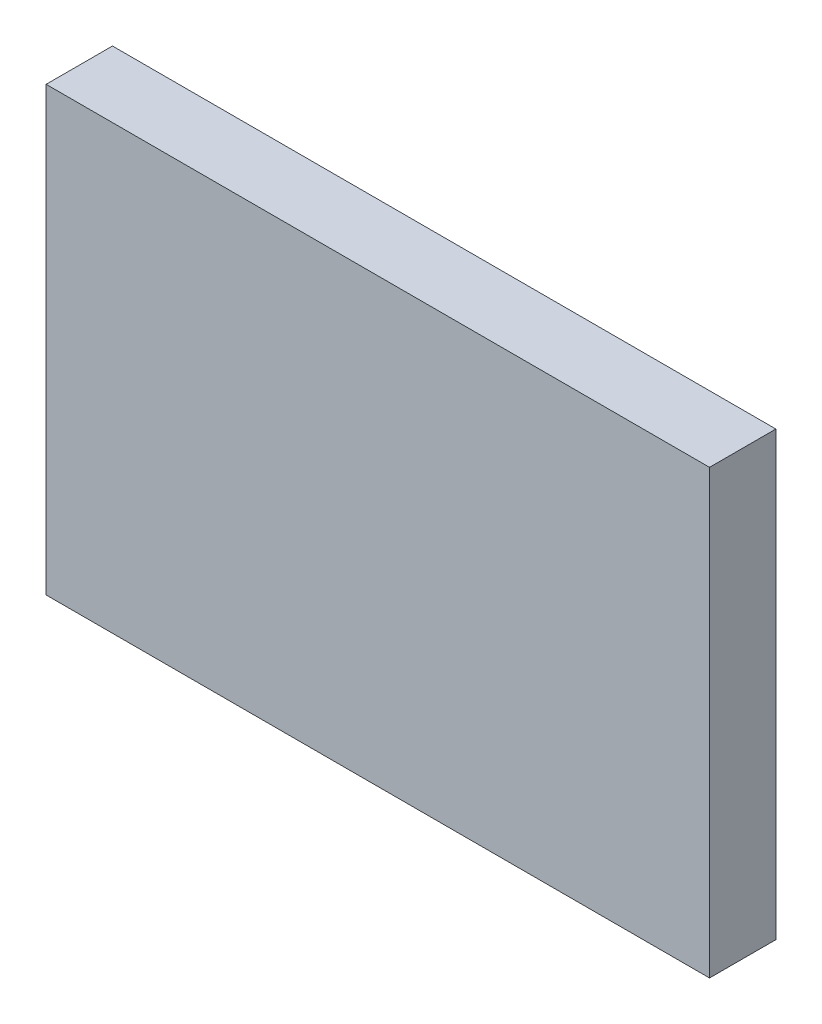
ISO-10303-21;
HEADER;
FILE_DESCRIPTION(('STEP AP214'),'2;1');
FILE_NAME('part.step','',(''),(''),'','','');
FILE_SCHEMA(('AUTOMOTIVE_DESIGN { 1 0 10303 214 1 1 1 1 }'));
ENDSEC;
DATA;
#1=APPLICATION_CONTEXT('core data for automotive mechanical design processes');
#2=APPLICATION_PROTOCOL_DEFINITION('international standard','automotive_design',2000,#1);
#3=PRODUCT_CONTEXT('',#1,'mechanical');
#4=PRODUCT('Part','Part','',(#3));
#5=PRODUCT_RELATED_PRODUCT_CATEGORY('part','',(#4));
#6=PRODUCT_DEFINITION_FORMATION('','',#4);
#7=PRODUCT_DEFINITION_CONTEXT('part definition',#1,'design');
#8=PRODUCT_DEFINITION('design','',#6,#7);
#9=PRODUCT_DEFINITION_SHAPE('','',#8);
#10=(LENGTH_UNIT() NAMED_UNIT(*) SI_UNIT(.MILLI.,.METRE.));
#11=(NAMED_UNIT(*) PLANE_ANGLE_UNIT() SI_UNIT($,.RADIAN.));
#12=(NAMED_UNIT(*) SI_UNIT($,.STERADIAN.) SOLID_ANGLE_UNIT());
#13=UNCERTAINTY_MEASURE_WITH_UNIT(LENGTH_MEASURE(1.E-05),#10,'distance_accuracy_value','');
#14=(GEOMETRIC_REPRESENTATION_CONTEXT(3) GLOBAL_UNCERTAINTY_ASSIGNED_CONTEXT((#13)) GLOBAL_UNIT_ASSIGNED_CONTEXT((#10,
#11,#12)) REPRESENTATION_CONTEXT('',''));
#15=CARTESIAN_POINT('',(0.,0.,0.));
#16=DIRECTION('',(0.,0.,1.));
#17=DIRECTION('',(1.,0.,0.));
#18=AXIS2_PLACEMENT_3D('',#15,#16,#17);
#19=CARTESIAN_POINT('',(75.,-50.,15.));
#20=DIRECTION('',(-1.,0.,0.));
#21=DIRECTION('',(0.,0.,1.));
#22=AXIS2_PLACEMENT_3D('',#19,#20,#21);
#23=PLANE('',#22);
#24=DIRECTION('',(0.,1.,0.));
#25=VECTOR('',#24,1.);
#26=CARTESIAN_POINT('',(75.,-50.,0.));
#27=LINE('',#26,#25);
#28=CARTESIAN_POINT('',(75.,-50.,0.));
#29=VERTEX_POINT('',#28);
#30=CARTESIAN_POINT('',(75.,50.,0.));
#31=VERTEX_POINT('',#30);
#32=EDGE_CURVE('E111',#29,#31,#27,.T.);
#33=ORIENTED_EDGE('',*,*,#32,.T.);
#34=DIRECTION('',(0.,0.,-1.));
#35=VECTOR('',#34,1.);
#36=CARTESIAN_POINT('',(75.,50.,15.));
#37=LINE('',#36,#35);
#38=CARTESIAN_POINT('',(75.,50.,15.));
#39=VERTEX_POINT('',#38);
#40=EDGE_CURVE('E11',#39,#31,#37,.T.);
#41=ORIENTED_EDGE('',*,*,#40,.F.);
#42=DIRECTION('',(0.,1.,0.));
#43=VECTOR('',#42,1.);
#44=CARTESIAN_POINT('',(75.,-50.,15.));
#45=LINE('',#44,#43);
#46=CARTESIAN_POINT('',(75.,-50.,15.));
#47=VERTEX_POINT('',#46);
#48=EDGE_CURVE('E100',#47,#39,#45,.T.);
#49=ORIENTED_EDGE('',*,*,#48,.F.);
#50=DIRECTION('',(0.,0.,-1.));
#51=VECTOR('',#50,1.);
#52=CARTESIAN_POINT('',(75.,-50.,15.));
#53=LINE('',#52,#51);
#54=EDGE_CURVE('E108',#47,#29,#53,.T.);
#55=ORIENTED_EDGE('',*,*,#54,.T.);
#56=EDGE_LOOP('',(#33,#41,#49,#55));
#57=FACE_BOUND('',#56,.T.);
#58=ADVANCED_FACE('F44',(#57),#23,.F.);
#59=CARTESIAN_POINT('',(-75.,50.,15.));
#60=DIRECTION('',(0.,-1.,0.));
#61=DIRECTION('',(0.,0.,-1.));
#62=AXIS2_PLACEMENT_3D('',#59,#60,#61);
#63=PLANE('',#62);
#64=DIRECTION('',(-1.,0.,0.));
#65=VECTOR('',#64,1.);
#66=CARTESIAN_POINT('',(-75.,50.,0.));
#67=LINE('',#66,#65);
#68=CARTESIAN_POINT('',(-75.,50.,0.));
#69=VERTEX_POINT('',#68);
#70=EDGE_CURVE('E105',#31,#69,#67,.T.);
#71=ORIENTED_EDGE('',*,*,#70,.T.);
#72=DIRECTION('',(0.,0.,-1.));
#73=VECTOR('',#72,1.);
#74=CARTESIAN_POINT('',(-75.,50.,15.));
#75=LINE('',#74,#73);
#76=CARTESIAN_POINT('',(-75.,50.,15.));
#77=VERTEX_POINT('',#76);
#78=EDGE_CURVE('E53',#77,#69,#75,.T.);
#79=ORIENTED_EDGE('',*,*,#78,.F.);
#80=DIRECTION('',(-1.,0.,0.));
#81=VECTOR('',#80,1.);
#82=CARTESIAN_POINT('',(-75.,50.,15.));
#83=LINE('',#82,#81);
#84=EDGE_CURVE('E95',#39,#77,#83,.T.);
#85=ORIENTED_EDGE('',*,*,#84,.F.);
#86=ORIENTED_EDGE('',*,*,#40,.T.);
#87=EDGE_LOOP('',(#71,#79,#85,#86));
#88=FACE_BOUND('',#87,.T.);
#89=ADVANCED_FACE('F102',(#88),#63,.F.);
#90=CARTESIAN_POINT('',(-75.,-50.,15.));
#91=DIRECTION('',(1.,0.,0.));
#92=DIRECTION('',(0.,0.,-1.));
#93=AXIS2_PLACEMENT_3D('',#90,#91,#92);
#94=PLANE('',#93);
#95=DIRECTION('',(0.,-1.,0.));
#96=VECTOR('',#95,1.);
#97=CARTESIAN_POINT('',(-75.,-50.,0.));
#98=LINE('',#97,#96);
#99=CARTESIAN_POINT('',(-75.,-50.,0.));
#100=VERTEX_POINT('',#99);
#101=EDGE_CURVE('E80',#69,#100,#98,.T.);
#102=ORIENTED_EDGE('',*,*,#101,.T.);
#103=DIRECTION('',(0.,0.,-1.));
#104=VECTOR('',#103,1.);
#105=CARTESIAN_POINT('',(-75.,-50.,15.));
#106=LINE('',#105,#104);
#107=CARTESIAN_POINT('',(-75.,-50.,15.));
#108=VERTEX_POINT('',#107);
#109=EDGE_CURVE('E101',#108,#100,#106,.T.);
#110=ORIENTED_EDGE('',*,*,#109,.F.);
#111=DIRECTION('',(0.,-1.,0.));
#112=VECTOR('',#111,1.);
#113=CARTESIAN_POINT('',(-75.,-50.,15.));
#114=LINE('',#113,#112);
#115=EDGE_CURVE('E94',#77,#108,#114,.T.);
#116=ORIENTED_EDGE('',*,*,#115,.F.);
#117=ORIENTED_EDGE('',*,*,#78,.T.);
#118=EDGE_LOOP('',(#102,#110,#116,#117));
#119=FACE_BOUND('',#118,.T.);
#120=ADVANCED_FACE('F103',(#119),#94,.F.);
#121=CARTESIAN_POINT('',(-75.,-50.,15.));
#122=DIRECTION('',(0.,1.,0.));
#123=DIRECTION('',(0.,0.,1.));
#124=AXIS2_PLACEMENT_3D('',#121,#122,#123);
#125=PLANE('',#124);
#126=DIRECTION('',(1.,0.,0.));
#127=VECTOR('',#126,1.);
#128=CARTESIAN_POINT('',(-75.,-50.,0.));
#129=LINE('',#128,#127);
#130=EDGE_CURVE('E82',#100,#29,#129,.T.);
#131=ORIENTED_EDGE('',*,*,#130,.T.);
#132=ORIENTED_EDGE('',*,*,#54,.F.);
#133=DIRECTION('',(1.,0.,0.));
#134=VECTOR('',#133,1.);
#135=CARTESIAN_POINT('',(-75.,-50.,15.));
#136=LINE('',#135,#134);
#137=EDGE_CURVE('E62',#108,#47,#136,.T.);
#138=ORIENTED_EDGE('',*,*,#137,.F.);
#139=ORIENTED_EDGE('',*,*,#109,.T.);
#140=EDGE_LOOP('',(#131,#132,#138,#139));
#141=FACE_BOUND('',#140,.T.);
#142=ADVANCED_FACE('F128',(#141),#125,.F.);
#143=CARTESIAN_POINT('',(0.,0.,15.));
#144=DIRECTION('',(0.,0.,-1.));
#145=DIRECTION('',(-1.,0.,0.));
#146=AXIS2_PLACEMENT_3D('',#143,#144,#145);
#147=PLANE('',#146);
#148=ORIENTED_EDGE('',*,*,#48,.T.);
#149=ORIENTED_EDGE('',*,*,#84,.T.);
#150=ORIENTED_EDGE('',*,*,#115,.T.);
#151=ORIENTED_EDGE('',*,*,#137,.T.);
#152=EDGE_LOOP('',(#148,#149,#150,#151));
#153=FACE_BOUND('',#152,.T.);
#154=ADVANCED_FACE('F93',(#153),#147,.F.);
#155=CARTESIAN_POINT('',(0.,0.,0.));
#156=DIRECTION('',(0.,0.,-1.));
#157=DIRECTION('',(-1.,0.,0.));
#158=AXIS2_PLACEMENT_3D('',#155,#156,#157);
#159=PLANE('',#158);
#160=ORIENTED_EDGE('',*,*,#32,.F.);
#161=ORIENTED_EDGE('',*,*,#130,.F.);
#162=ORIENTED_EDGE('',*,*,#101,.F.);
#163=ORIENTED_EDGE('',*,*,#70,.F.);
#164=EDGE_LOOP('',(#160,#161,#162,#163));
#165=FACE_BOUND('',#164,.T.);
#166=ADVANCED_FACE('F129',(#165),#159,.T.);
#167=CLOSED_SHELL('',(#58,#89,#120,#142,#154,#166));
#168=MANIFOLD_SOLID_BREP('B2',#167);
#169=ADVANCED_BREP_SHAPE_REPRESENTATION('',(#18,#168),#14);
#170=SHAPE_DEFINITION_REPRESENTATION(#9,#169);
ENDSEC;
END-ISO-10303-21;
